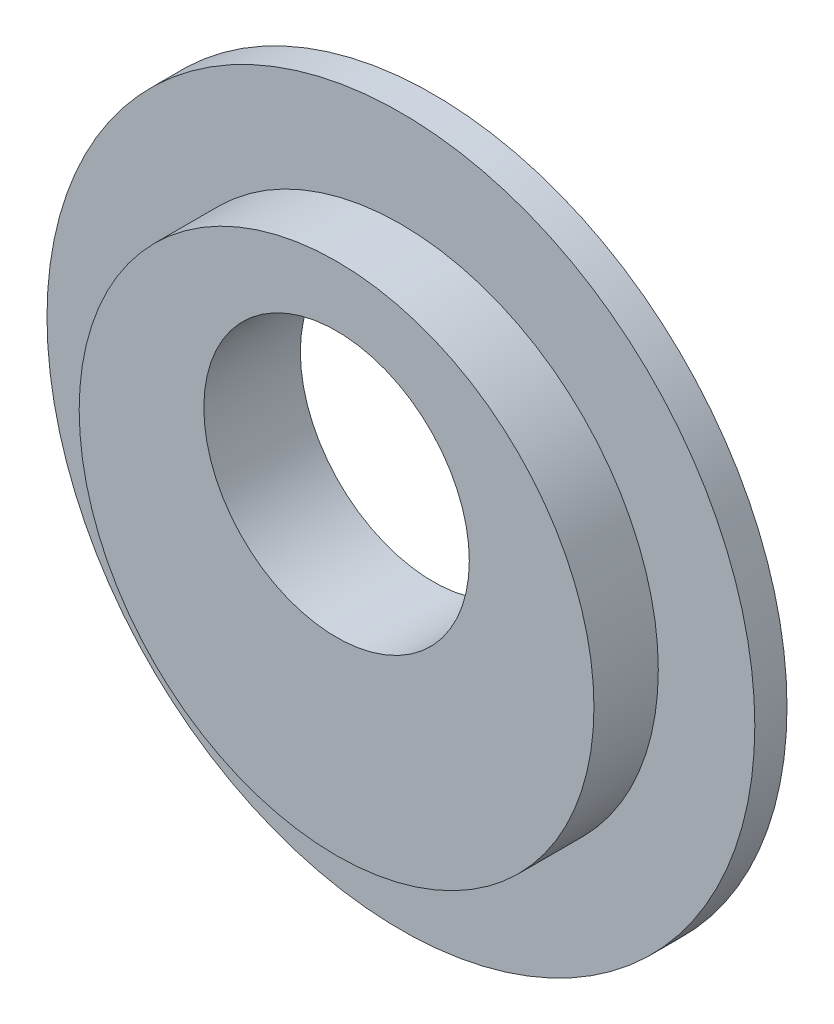
ISO-10303-21;
HEADER;
FILE_DESCRIPTION(('STEP AP214'),'2;1');
FILE_NAME('part.step','',(''),(''),'','','');
FILE_SCHEMA(('AUTOMOTIVE_DESIGN { 1 0 10303 214 1 1 1 1 }'));
ENDSEC;
DATA;
#1=APPLICATION_CONTEXT('core data for automotive mechanical design processes');
#2=APPLICATION_PROTOCOL_DEFINITION('international standard','automotive_design',2000,#1);
#3=PRODUCT_CONTEXT('',#1,'mechanical');
#4=PRODUCT('Part','Part','',(#3));
#5=PRODUCT_RELATED_PRODUCT_CATEGORY('part','',(#4));
#6=PRODUCT_DEFINITION_FORMATION('','',#4);
#7=PRODUCT_DEFINITION_CONTEXT('part definition',#1,'design');
#8=PRODUCT_DEFINITION('design','',#6,#7);
#9=PRODUCT_DEFINITION_SHAPE('','',#8);
#10=(LENGTH_UNIT() NAMED_UNIT(*) SI_UNIT(.MILLI.,.METRE.));
#11=(NAMED_UNIT(*) PLANE_ANGLE_UNIT() SI_UNIT($,.RADIAN.));
#12=(NAMED_UNIT(*) SI_UNIT($,.STERADIAN.) SOLID_ANGLE_UNIT());
#13=UNCERTAINTY_MEASURE_WITH_UNIT(LENGTH_MEASURE(1.E-05),#10,'distance_accuracy_value','');
#14=(GEOMETRIC_REPRESENTATION_CONTEXT(3) GLOBAL_UNCERTAINTY_ASSIGNED_CONTEXT((#13)) GLOBAL_UNIT_ASSIGNED_CONTEXT((#10,
#11,#12)) REPRESENTATION_CONTEXT('',''));
#15=CARTESIAN_POINT('',(0.,0.,0.));
#16=DIRECTION('',(0.,0.,1.));
#17=DIRECTION('',(1.,0.,0.));
#18=AXIS2_PLACEMENT_3D('',#15,#16,#17);
#19=CARTESIAN_POINT('',(0.,3.175,1.5875));
#20=DIRECTION('',(0.,0.,-1.));
#21=DIRECTION('',(-1.,0.,0.));
#22=AXIS2_PLACEMENT_3D('',#19,#20,#21);
#23=CYLINDRICAL_SURFACE('',#22,6.55);
#24=CARTESIAN_POINT('',(0.,3.175,0.));
#25=DIRECTION('',(0.,0.,1.));
#26=DIRECTION('',(1.,0.,0.));
#27=AXIS2_PLACEMENT_3D('',#24,#25,#26);
#28=CIRCLE('',#27,6.55);
#29=CARTESIAN_POINT('',(6.55,3.175,0.));
#30=VERTEX_POINT('',#29);
#31=EDGE_CURVE('E55',#30,#30,#28,.T.);
#32=ORIENTED_EDGE('',*,*,#31,.F.);
#33=EDGE_LOOP('',(#32));
#34=FACE_BOUND('',#33,.T.);
#35=CARTESIAN_POINT('',(0.,3.175,4.7625));
#36=DIRECTION('',(0.,0.,1.));
#37=DIRECTION('',(1.,0.,0.));
#38=AXIS2_PLACEMENT_3D('',#35,#36,#37);
#39=CIRCLE('',#38,6.55);
#40=CARTESIAN_POINT('',(6.55,3.175,4.7625));
#41=VERTEX_POINT('',#40);
#42=EDGE_CURVE('E61',#41,#41,#39,.F.);
#43=ORIENTED_EDGE('',*,*,#42,.F.);
#44=EDGE_LOOP('',(#43));
#45=FACE_BOUND('',#44,.T.);
#46=ADVANCED_FACE('F39',(#34,#45),#23,.F.);
#47=CARTESIAN_POINT('',(0.,0.,1.5875));
#48=DIRECTION('',(0.,0.,-1.));
#49=DIRECTION('',(-1.,0.,0.));
#50=AXIS2_PLACEMENT_3D('',#47,#48,#49);
#51=CYLINDRICAL_SURFACE('',#50,17.4625);
#52=CARTESIAN_POINT('',(0.,0.,1.5875));
#53=DIRECTION('',(0.,0.,1.));
#54=DIRECTION('',(1.,0.,0.));
#55=AXIS2_PLACEMENT_3D('',#52,#53,#54);
#56=CIRCLE('',#55,17.4625);
#57=CARTESIAN_POINT('',(17.4625,0.,1.5875));
#58=VERTEX_POINT('',#57);
#59=EDGE_CURVE('E46',#58,#58,#56,.T.);
#60=ORIENTED_EDGE('',*,*,#59,.F.);
#61=EDGE_LOOP('',(#60));
#62=FACE_BOUND('',#61,.T.);
#63=CARTESIAN_POINT('',(0.,0.,0.));
#64=DIRECTION('',(0.,0.,1.));
#65=DIRECTION('',(1.,0.,0.));
#66=AXIS2_PLACEMENT_3D('',#63,#64,#65);
#67=CIRCLE('',#66,17.4625);
#68=CARTESIAN_POINT('',(17.4625,0.,0.));
#69=VERTEX_POINT('',#68);
#70=EDGE_CURVE('E42',#69,#69,#67,.T.);
#71=ORIENTED_EDGE('',*,*,#70,.T.);
#72=EDGE_LOOP('',(#71));
#73=FACE_BOUND('',#72,.T.);
#74=ADVANCED_FACE('F70',(#62,#73),#51,.T.);
#75=CARTESIAN_POINT('',(0.,0.,1.5875));
#76=DIRECTION('',(0.,0.,1.));
#77=DIRECTION('',(1.,0.,0.));
#78=AXIS2_PLACEMENT_3D('',#75,#76,#77);
#79=PLANE('',#78);
#80=CARTESIAN_POINT('',(0.,0.,1.5875));
#81=DIRECTION('',(0.,0.,1.));
#82=DIRECTION('',(1.,0.,0.));
#83=AXIS2_PLACEMENT_3D('',#80,#81,#82);
#84=CIRCLE('',#83,12.7);
#85=CARTESIAN_POINT('',(12.7,0.,1.5875));
#86=VERTEX_POINT('',#85);
#87=EDGE_CURVE('E10',#86,#86,#84,.T.);
#88=ORIENTED_EDGE('',*,*,#87,.F.);
#89=EDGE_LOOP('',(#88));
#90=FACE_BOUND('',#89,.T.);
#91=ORIENTED_EDGE('',*,*,#59,.T.);
#92=EDGE_LOOP('',(#91));
#93=FACE_BOUND('',#92,.T.);
#94=ADVANCED_FACE('F77',(#90,#93),#79,.T.);
#95=CARTESIAN_POINT('',(0.,0.,0.));
#96=DIRECTION('',(0.,0.,1.));
#97=DIRECTION('',(1.,0.,0.));
#98=AXIS2_PLACEMENT_3D('',#95,#96,#97);
#99=PLANE('',#98);
#100=ORIENTED_EDGE('',*,*,#31,.T.);
#101=EDGE_LOOP('',(#100));
#102=FACE_BOUND('',#101,.T.);
#103=ORIENTED_EDGE('',*,*,#70,.F.);
#104=EDGE_LOOP('',(#103));
#105=FACE_BOUND('',#104,.T.);
#106=ADVANCED_FACE('F81',(#102,#105),#99,.F.);
#107=CARTESIAN_POINT('',(0.,0.,4.7625));
#108=DIRECTION('',(0.,0.,-1.));
#109=DIRECTION('',(-1.,0.,0.));
#110=AXIS2_PLACEMENT_3D('',#107,#108,#109);
#111=CYLINDRICAL_SURFACE('',#110,12.7);
#112=CARTESIAN_POINT('',(0.,0.,4.7625));
#113=DIRECTION('',(0.,0.,1.));
#114=DIRECTION('',(1.,0.,0.));
#115=AXIS2_PLACEMENT_3D('',#112,#113,#114);
#116=CIRCLE('',#115,12.7);
#117=CARTESIAN_POINT('',(12.7,0.,4.7625));
#118=VERTEX_POINT('',#117);
#119=EDGE_CURVE('E53',#118,#118,#116,.T.);
#120=ORIENTED_EDGE('',*,*,#119,.F.);
#121=EDGE_LOOP('',(#120));
#122=FACE_BOUND('',#121,.T.);
#123=ORIENTED_EDGE('',*,*,#87,.T.);
#124=EDGE_LOOP('',(#123));
#125=FACE_BOUND('',#124,.T.);
#126=ADVANCED_FACE('F87',(#122,#125),#111,.T.);
#127=CARTESIAN_POINT('',(0.,0.,4.7625));
#128=DIRECTION('',(0.,0.,1.));
#129=DIRECTION('',(1.,0.,0.));
#130=AXIS2_PLACEMENT_3D('',#127,#128,#129);
#131=PLANE('',#130);
#132=ORIENTED_EDGE('',*,*,#42,.T.);
#133=EDGE_LOOP('',(#132));
#134=FACE_BOUND('',#133,.T.);
#135=ORIENTED_EDGE('',*,*,#119,.T.);
#136=EDGE_LOOP('',(#135));
#137=FACE_BOUND('',#136,.T.);
#138=ADVANCED_FACE('F67',(#134,#137),#131,.T.);
#139=CLOSED_SHELL('',(#46,#74,#94,#106,#126,#138));
#140=MANIFOLD_SOLID_BREP('B2',#139);
#141=ADVANCED_BREP_SHAPE_REPRESENTATION('',(#18,#140),#14);
#142=SHAPE_DEFINITION_REPRESENTATION(#9,#141);
ENDSEC;
END-ISO-10303-21;
